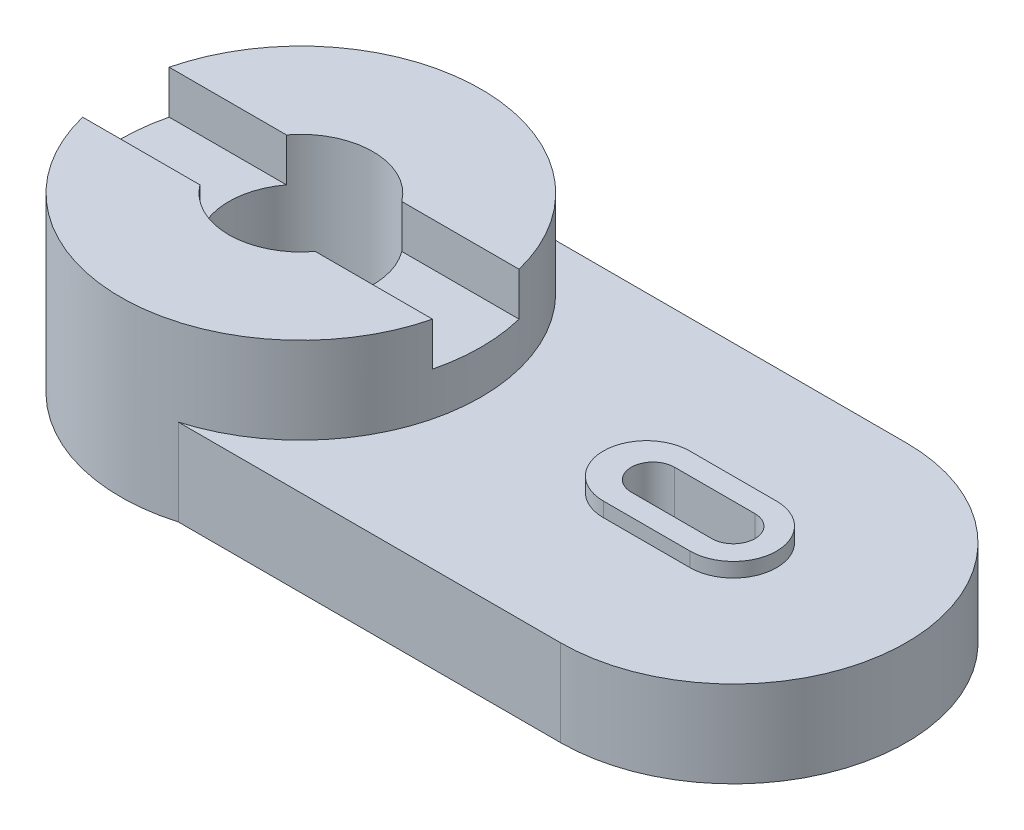
ISO-10303-21;
HEADER;
FILE_DESCRIPTION(('STEP AP214'),'2;1');
FILE_NAME('part.step','',(''),(''),'','','');
FILE_SCHEMA(('AUTOMOTIVE_DESIGN { 1 0 10303 214 1 1 1 1 }'));
ENDSEC;
DATA;
#1=APPLICATION_CONTEXT('core data for automotive mechanical design processes');
#2=APPLICATION_PROTOCOL_DEFINITION('international standard','automotive_design',2000,#1);
#3=PRODUCT_CONTEXT('',#1,'mechanical');
#4=PRODUCT('Part','Part','',(#3));
#5=PRODUCT_RELATED_PRODUCT_CATEGORY('part','',(#4));
#6=PRODUCT_DEFINITION_FORMATION('','',#4);
#7=PRODUCT_DEFINITION_CONTEXT('part definition',#1,'design');
#8=PRODUCT_DEFINITION('design','',#6,#7);
#9=PRODUCT_DEFINITION_SHAPE('','',#8);
#10=(LENGTH_UNIT() NAMED_UNIT(*) SI_UNIT(.MILLI.,.METRE.));
#11=(NAMED_UNIT(*) PLANE_ANGLE_UNIT() SI_UNIT($,.RADIAN.));
#12=(NAMED_UNIT(*) SI_UNIT($,.STERADIAN.) SOLID_ANGLE_UNIT());
#13=UNCERTAINTY_MEASURE_WITH_UNIT(LENGTH_MEASURE(1.E-05),#10,'distance_accuracy_value','');
#14=(GEOMETRIC_REPRESENTATION_CONTEXT(3) GLOBAL_UNCERTAINTY_ASSIGNED_CONTEXT((#13)) GLOBAL_UNIT_ASSIGNED_CONTEXT((#10,
#11,#12)) REPRESENTATION_CONTEXT('',''));
#15=CARTESIAN_POINT('',(0.,0.,0.));
#16=DIRECTION('',(0.,0.,1.));
#17=DIRECTION('',(1.,0.,0.));
#18=AXIS2_PLACEMENT_3D('',#15,#16,#17);
#19=CARTESIAN_POINT('',(-76.2,60.96,0.));
#20=DIRECTION('',(0.,1.,0.));
#21=DIRECTION('',(0.,0.,1.));
#22=AXIS2_PLACEMENT_3D('',#19,#20,#21);
#23=PLANE('',#22);
#24=DIRECTION('',(1.,0.,0.));
#25=VECTOR('',#24,1.);
#26=CARTESIAN_POINT('',(-137.844078385519,60.96,15.24));
#27=LINE('',#26,#25);
#28=CARTESIAN_POINT('',(-137.844078385519,60.96,15.24));
#29=VERTEX_POINT('',#28);
#30=CARTESIAN_POINT('',(-96.52,60.96,15.24));
#31=VERTEX_POINT('',#30);
#32=EDGE_CURVE('E186',#29,#31,#27,.T.);
#33=ORIENTED_EDGE('',*,*,#32,.F.);
#34=CARTESIAN_POINT('',(-76.2,60.96,0.));
#35=DIRECTION('',(0.,1.,0.));
#36=DIRECTION('',(0.,0.,1.));
#37=AXIS2_PLACEMENT_3D('',#34,#35,#36);
#38=CIRCLE('',#37,63.5);
#39=CARTESIAN_POINT('',(-14.555921614481,60.96,15.24));
#40=VERTEX_POINT('',#39);
#41=EDGE_CURVE('E281',#29,#40,#38,.T.);
#42=ORIENTED_EDGE('',*,*,#41,.T.);
#43=CARTESIAN_POINT('',(-55.88,60.96,15.24));
#44=VERTEX_POINT('',#43);
#45=EDGE_CURVE('E329',#44,#40,#27,.T.);
#46=ORIENTED_EDGE('',*,*,#45,.F.);
#47=CARTESIAN_POINT('',(-76.2,60.96,0.));
#48=DIRECTION('',(0.,1.,0.));
#49=DIRECTION('',(0.,0.,1.));
#50=AXIS2_PLACEMENT_3D('',#47,#48,#49);
#51=CIRCLE('',#50,25.4);
#52=EDGE_CURVE('E271',#31,#44,#51,.T.);
#53=ORIENTED_EDGE('',*,*,#52,.F.);
#54=EDGE_LOOP('',(#33,#42,#46,#53));
#55=FACE_BOUND('',#54,.T.);
#56=ADVANCED_FACE('F33',(#55),#23,.T.);
#57=CARTESIAN_POINT('',(0.,30.48,0.));
#58=DIRECTION('',(0.,-1.,0.));
#59=DIRECTION('',(0.,0.,-1.));
#60=AXIS2_PLACEMENT_3D('',#57,#58,#59);
#61=PLANE('',#60);
#62=CARTESIAN_POINT('',(-76.2,30.48,0.));
#63=DIRECTION('',(0.,-1.,0.));
#64=DIRECTION('',(0.,0.,-1.));
#65=AXIS2_PLACEMENT_3D('',#62,#63,#64);
#66=CIRCLE('',#65,63.5);
#67=CARTESIAN_POINT('',(-58.42,30.48,60.96));
#68=VERTEX_POINT('',#67);
#69=CARTESIAN_POINT('',(-58.4199999999999,30.48,-60.96));
#70=VERTEX_POINT('',#69);
#71=EDGE_CURVE('E286',#68,#70,#66,.F.);
#72=ORIENTED_EDGE('',*,*,#71,.F.);
#73=DIRECTION('',(1.,0.,0.));
#74=VECTOR('',#73,1.);
#75=CARTESIAN_POINT('',(-76.2,30.48,60.96));
#76=LINE('',#75,#74);
#77=CARTESIAN_POINT('',(76.2,30.48,60.96));
#78=VERTEX_POINT('',#77);
#79=EDGE_CURVE('E298',#68,#78,#76,.T.);
#80=ORIENTED_EDGE('',*,*,#79,.T.);
#81=CARTESIAN_POINT('',(76.2,30.48,0.));
#82=DIRECTION('',(0.,1.,0.));
#83=DIRECTION('',(0.,0.,-1.));
#84=AXIS2_PLACEMENT_3D('',#81,#82,#83);
#85=CIRCLE('',#84,60.96);
#86=CARTESIAN_POINT('',(76.2,30.48,-60.96));
#87=VERTEX_POINT('',#86);
#88=EDGE_CURVE('E267',#78,#87,#85,.T.);
#89=ORIENTED_EDGE('',*,*,#88,.T.);
#90=DIRECTION('',(-1.,0.,0.));
#91=VECTOR('',#90,1.);
#92=CARTESIAN_POINT('',(-76.2,30.48,-60.96));
#93=LINE('',#92,#91);
#94=EDGE_CURVE('E296',#87,#70,#93,.T.);
#95=ORIENTED_EDGE('',*,*,#94,.T.);
#96=EDGE_LOOP('',(#72,#80,#89,#95));
#97=FACE_BOUND('',#96,.T.);
#98=CARTESIAN_POINT('',(76.2,30.48,0.));
#99=DIRECTION('',(0.,1.,0.));
#100=DIRECTION('',(0.,0.,1.));
#101=AXIS2_PLACEMENT_3D('',#98,#99,#100);
#102=CIRCLE('',#101,15.24);
#103=CARTESIAN_POINT('',(76.2,30.48,15.24));
#104=VERTEX_POINT('',#103);
#105=CARTESIAN_POINT('',(76.2,30.48,-15.24));
#106=VERTEX_POINT('',#105);
#107=EDGE_CURVE('E228',#104,#106,#102,.T.);
#108=ORIENTED_EDGE('',*,*,#107,.F.);
#109=DIRECTION('',(1.,0.,0.));
#110=VECTOR('',#109,1.);
#111=CARTESIAN_POINT('',(76.2,30.48,15.24));
#112=LINE('',#111,#110);
#113=CARTESIAN_POINT('',(45.5973373324809,30.48,15.24));
#114=VERTEX_POINT('',#113);
#115=EDGE_CURVE('E239',#114,#104,#112,.T.);
#116=ORIENTED_EDGE('',*,*,#115,.F.);
#117=CARTESIAN_POINT('',(45.5973373324809,30.48,0.));
#118=DIRECTION('',(0.,1.,0.));
#119=DIRECTION('',(0.,0.,1.));
#120=AXIS2_PLACEMENT_3D('',#117,#118,#119);
#121=CIRCLE('',#120,15.24);
#122=CARTESIAN_POINT('',(45.5973373324809,30.48,-15.24));
#123=VERTEX_POINT('',#122);
#124=EDGE_CURVE('E251',#123,#114,#121,.T.);
#125=ORIENTED_EDGE('',*,*,#124,.F.);
#126=DIRECTION('',(-1.,0.,0.));
#127=VECTOR('',#126,1.);
#128=CARTESIAN_POINT('',(76.2,30.48,-15.24));
#129=LINE('',#128,#127);
#130=EDGE_CURVE('E248',#106,#123,#129,.T.);
#131=ORIENTED_EDGE('',*,*,#130,.F.);
#132=EDGE_LOOP('',(#108,#116,#125,#131));
#133=FACE_BOUND('',#132,.T.);
#134=ADVANCED_FACE('F358',(#97,#133),#61,.F.);
#135=CARTESIAN_POINT('',(-76.2,30.48,-60.96));
#136=DIRECTION('',(0.,0.,1.));
#137=DIRECTION('',(1.,0.,0.));
#138=AXIS2_PLACEMENT_3D('',#135,#136,#137);
#139=PLANE('',#138);
#140=DIRECTION('',(0.,-1.,0.));
#141=VECTOR('',#140,1.);
#142=CARTESIAN_POINT('',(-58.4199999999999,60.96,-60.96));
#143=LINE('',#142,#141);
#144=CARTESIAN_POINT('',(-58.4199999999999,0.,-60.96));
#145=VERTEX_POINT('',#144);
#146=EDGE_CURVE('E292',#70,#145,#143,.T.);
#147=ORIENTED_EDGE('',*,*,#146,.F.);
#148=ORIENTED_EDGE('',*,*,#94,.F.);
#149=DIRECTION('',(0.,-1.,0.));
#150=VECTOR('',#149,1.);
#151=CARTESIAN_POINT('',(76.2,30.48,-60.96));
#152=LINE('',#151,#150);
#153=CARTESIAN_POINT('',(76.2,0.,-60.96));
#154=VERTEX_POINT('',#153);
#155=EDGE_CURVE('E306',#87,#154,#152,.T.);
#156=ORIENTED_EDGE('',*,*,#155,.T.);
#157=DIRECTION('',(-1.,0.,0.));
#158=VECTOR('',#157,1.);
#159=CARTESIAN_POINT('',(-76.2,0.,-60.96));
#160=LINE('',#159,#158);
#161=EDGE_CURVE('E295',#154,#145,#160,.T.);
#162=ORIENTED_EDGE('',*,*,#161,.T.);
#163=EDGE_LOOP('',(#147,#148,#156,#162));
#164=FACE_BOUND('',#163,.T.);
#165=ADVANCED_FACE('F35',(#164),#139,.F.);
#166=CARTESIAN_POINT('',(-76.2,30.48,60.96));
#167=DIRECTION('',(0.,0.,-1.));
#168=DIRECTION('',(-1.,0.,0.));
#169=AXIS2_PLACEMENT_3D('',#166,#167,#168);
#170=PLANE('',#169);
#171=DIRECTION('',(0.,-1.,0.));
#172=VECTOR('',#171,1.);
#173=CARTESIAN_POINT('',(-58.42,60.96,60.96));
#174=LINE('',#173,#172);
#175=CARTESIAN_POINT('',(-58.42,0.,60.96));
#176=VERTEX_POINT('',#175);
#177=EDGE_CURVE('E289',#176,#68,#174,.F.);
#178=ORIENTED_EDGE('',*,*,#177,.F.);
#179=DIRECTION('',(1.,0.,0.));
#180=VECTOR('',#179,1.);
#181=CARTESIAN_POINT('',(-76.2,0.,60.96));
#182=LINE('',#181,#180);
#183=CARTESIAN_POINT('',(76.2,0.,60.96));
#184=VERTEX_POINT('',#183);
#185=EDGE_CURVE('E299',#176,#184,#182,.T.);
#186=ORIENTED_EDGE('',*,*,#185,.T.);
#187=DIRECTION('',(0.,-1.,0.));
#188=VECTOR('',#187,1.);
#189=CARTESIAN_POINT('',(76.2,30.48,60.96));
#190=LINE('',#189,#188);
#191=EDGE_CURVE('E301',#78,#184,#190,.T.);
#192=ORIENTED_EDGE('',*,*,#191,.F.);
#193=ORIENTED_EDGE('',*,*,#79,.F.);
#194=EDGE_LOOP('',(#178,#186,#192,#193));
#195=FACE_BOUND('',#194,.T.);
#196=ADVANCED_FACE('F367',(#195),#170,.F.);
#197=CARTESIAN_POINT('',(0.,0.,0.));
#198=DIRECTION('',(0.,-1.,0.));
#199=DIRECTION('',(0.,0.,-1.));
#200=AXIS2_PLACEMENT_3D('',#197,#198,#199);
#201=PLANE('',#200);
#202=CARTESIAN_POINT('',(76.2,0.,0.));
#203=DIRECTION('',(0.,1.,0.));
#204=DIRECTION('',(0.,0.,1.));
#205=AXIS2_PLACEMENT_3D('',#202,#203,#204);
#206=CIRCLE('',#205,7.62);
#207=CARTESIAN_POINT('',(76.2,0.,7.62000000000001));
#208=VERTEX_POINT('',#207);
#209=CARTESIAN_POINT('',(76.2,0.,-7.61999999999999));
#210=VERTEX_POINT('',#209);
#211=EDGE_CURVE('E201',#208,#210,#206,.T.);
#212=ORIENTED_EDGE('',*,*,#211,.T.);
#213=DIRECTION('',(-1.,0.,0.));
#214=VECTOR('',#213,1.);
#215=CARTESIAN_POINT('',(76.2,0.,-7.61999999999999));
#216=LINE('',#215,#214);
#217=CARTESIAN_POINT('',(47.8460105471044,0.,-7.62));
#218=VERTEX_POINT('',#217);
#219=EDGE_CURVE('E204',#210,#218,#216,.T.);
#220=ORIENTED_EDGE('',*,*,#219,.T.);
#221=CARTESIAN_POINT('',(47.8460105471044,0.,0.));
#222=DIRECTION('',(0.,1.,0.));
#223=DIRECTION('',(0.,0.,1.));
#224=AXIS2_PLACEMENT_3D('',#221,#222,#223);
#225=CIRCLE('',#224,7.62);
#226=CARTESIAN_POINT('',(47.8460105471044,0.,7.62));
#227=VERTEX_POINT('',#226);
#228=EDGE_CURVE('E208',#218,#227,#225,.T.);
#229=ORIENTED_EDGE('',*,*,#228,.T.);
#230=DIRECTION('',(1.,0.,0.));
#231=VECTOR('',#230,1.);
#232=CARTESIAN_POINT('',(76.2,0.,7.62000000000001));
#233=LINE('',#232,#231);
#234=EDGE_CURVE('E211',#227,#208,#233,.T.);
#235=ORIENTED_EDGE('',*,*,#234,.T.);
#236=EDGE_LOOP('',(#212,#220,#229,#235));
#237=FACE_BOUND('',#236,.T.);
#238=CARTESIAN_POINT('',(-76.2,0.,0.));
#239=DIRECTION('',(0.,1.,0.));
#240=DIRECTION('',(0.,0.,1.));
#241=AXIS2_PLACEMENT_3D('',#238,#239,#240);
#242=CIRCLE('',#241,25.4);
#243=CARTESIAN_POINT('',(-76.2,0.,25.4));
#244=VERTEX_POINT('',#243);
#245=EDGE_CURVE('E274',#244,#244,#242,.T.);
#246=ORIENTED_EDGE('',*,*,#245,.T.);
#247=EDGE_LOOP('',(#246));
#248=FACE_BOUND('',#247,.T.);
#249=ORIENTED_EDGE('',*,*,#185,.F.);
#250=CARTESIAN_POINT('',(-76.2,0.,0.));
#251=DIRECTION('',(0.,1.,0.));
#252=DIRECTION('',(0.,0.,1.));
#253=AXIS2_PLACEMENT_3D('',#250,#251,#252);
#254=CIRCLE('',#253,63.5);
#255=EDGE_CURVE('E277',#145,#176,#254,.T.);
#256=ORIENTED_EDGE('',*,*,#255,.F.);
#257=ORIENTED_EDGE('',*,*,#161,.F.);
#258=CARTESIAN_POINT('',(76.2,0.,0.));
#259=DIRECTION('',(0.,1.,0.));
#260=DIRECTION('',(0.,0.,-1.));
#261=AXIS2_PLACEMENT_3D('',#258,#259,#260);
#262=CIRCLE('',#261,60.96);
#263=EDGE_CURVE('E268',#184,#154,#262,.T.);
#264=ORIENTED_EDGE('',*,*,#263,.F.);
#265=EDGE_LOOP('',(#249,#256,#257,#264));
#266=FACE_BOUND('',#265,.T.);
#267=ADVANCED_FACE('F355',(#237,#248,#266),#201,.T.);
#268=CARTESIAN_POINT('',(-76.2,60.96,0.));
#269=DIRECTION('',(0.,-1.,0.));
#270=DIRECTION('',(0.,0.,-1.));
#271=AXIS2_PLACEMENT_3D('',#268,#269,#270);
#272=CYLINDRICAL_SURFACE('',#271,63.5);
#273=CARTESIAN_POINT('',(-76.2,45.72,0.));
#274=DIRECTION('',(0.,1.,0.));
#275=DIRECTION('',(0.,0.,1.));
#276=AXIS2_PLACEMENT_3D('',#273,#274,#275);
#277=CIRCLE('',#276,63.5);
#278=CARTESIAN_POINT('',(-14.555921614481,45.72,15.24));
#279=VERTEX_POINT('',#278);
#280=CARTESIAN_POINT('',(-14.555921614481,45.72,-15.24));
#281=VERTEX_POINT('',#280);
#282=EDGE_CURVE('E179',#279,#281,#277,.T.);
#283=ORIENTED_EDGE('',*,*,#282,.F.);
#284=DIRECTION('',(0.,1.,0.));
#285=VECTOR('',#284,1.);
#286=CARTESIAN_POINT('',(-14.555921614481,45.72,15.24));
#287=LINE('',#286,#285);
#288=EDGE_CURVE('E218',#279,#40,#287,.T.);
#289=ORIENTED_EDGE('',*,*,#288,.T.);
#290=ORIENTED_EDGE('',*,*,#41,.F.);
#291=DIRECTION('',(0.,1.,0.));
#292=VECTOR('',#291,1.);
#293=CARTESIAN_POINT('',(-137.844078385519,45.72,15.24));
#294=LINE('',#293,#292);
#295=CARTESIAN_POINT('',(-137.844078385519,45.72,15.24));
#296=VERTEX_POINT('',#295);
#297=EDGE_CURVE('E196',#296,#29,#294,.T.);
#298=ORIENTED_EDGE('',*,*,#297,.F.);
#299=CARTESIAN_POINT('',(-76.2,45.72,0.));
#300=DIRECTION('',(0.,1.,0.));
#301=DIRECTION('',(0.,0.,-1.));
#302=AXIS2_PLACEMENT_3D('',#299,#300,#301);
#303=CIRCLE('',#302,63.5);
#304=CARTESIAN_POINT('',(-137.844078385519,45.72,-15.24));
#305=VERTEX_POINT('',#304);
#306=EDGE_CURVE('E175',#305,#296,#303,.T.);
#307=ORIENTED_EDGE('',*,*,#306,.F.);
#308=DIRECTION('',(0.,1.,0.));
#309=VECTOR('',#308,1.);
#310=CARTESIAN_POINT('',(-137.844078385519,45.72,-15.24));
#311=LINE('',#310,#309);
#312=CARTESIAN_POINT('',(-137.844078385519,60.96,-15.24));
#313=VERTEX_POINT('',#312);
#314=EDGE_CURVE('E194',#305,#313,#311,.T.);
#315=ORIENTED_EDGE('',*,*,#314,.T.);
#316=CARTESIAN_POINT('',(-14.555921614481,60.96,-15.24));
#317=VERTEX_POINT('',#316);
#318=EDGE_CURVE('E193',#317,#313,#38,.T.);
#319=ORIENTED_EDGE('',*,*,#318,.F.);
#320=DIRECTION('',(0.,1.,0.));
#321=VECTOR('',#320,1.);
#322=CARTESIAN_POINT('',(-14.555921614481,45.72,-15.24));
#323=LINE('',#322,#321);
#324=EDGE_CURVE('E170',#281,#317,#323,.T.);
#325=ORIENTED_EDGE('',*,*,#324,.F.);
#326=EDGE_LOOP('',(#283,#289,#290,#298,#307,#315,#319,#325));
#327=FACE_BOUND('',#326,.T.);
#328=ORIENTED_EDGE('',*,*,#71,.T.);
#329=ORIENTED_EDGE('',*,*,#146,.T.);
#330=ORIENTED_EDGE('',*,*,#255,.T.);
#331=ORIENTED_EDGE('',*,*,#177,.T.);
#332=EDGE_LOOP('',(#328,#329,#330,#331));
#333=FACE_BOUND('',#332,.T.);
#334=ADVANCED_FACE('F189',(#327,#333),#272,.T.);
#335=DIRECTION('',(-1.,0.,0.));
#336=VECTOR('',#335,1.);
#337=CARTESIAN_POINT('',(-137.844078385519,60.96,-15.24));
#338=LINE('',#337,#336);
#339=CARTESIAN_POINT('',(-55.88,60.96,-15.24));
#340=VERTEX_POINT('',#339);
#341=EDGE_CURVE('E327',#317,#340,#338,.T.);
#342=ORIENTED_EDGE('',*,*,#341,.F.);
#343=ORIENTED_EDGE('',*,*,#318,.T.);
#344=CARTESIAN_POINT('',(-96.52,60.96,-15.24));
#345=VERTEX_POINT('',#344);
#346=EDGE_CURVE('E330',#345,#313,#338,.T.);
#347=ORIENTED_EDGE('',*,*,#346,.F.);
#348=EDGE_CURVE('E278',#340,#345,#51,.T.);
#349=ORIENTED_EDGE('',*,*,#348,.F.);
#350=EDGE_LOOP('',(#342,#343,#347,#349));
#351=FACE_BOUND('',#350,.T.);
#352=ADVANCED_FACE('F346',(#351),#23,.T.);
#353=CARTESIAN_POINT('',(-76.2,0.,0.));
#354=DIRECTION('',(0.,1.,0.));
#355=DIRECTION('',(0.,0.,1.));
#356=AXIS2_PLACEMENT_3D('',#353,#354,#355);
#357=CYLINDRICAL_SURFACE('',#356,25.4);
#358=CARTESIAN_POINT('',(-76.2,45.72,0.));
#359=DIRECTION('',(0.,1.,0.));
#360=DIRECTION('',(0.,0.,1.));
#361=AXIS2_PLACEMENT_3D('',#358,#359,#360);
#362=CIRCLE('',#361,25.4);
#363=CARTESIAN_POINT('',(-96.52,45.72,15.24));
#364=VERTEX_POINT('',#363);
#365=CARTESIAN_POINT('',(-96.52,45.72,-15.24));
#366=VERTEX_POINT('',#365);
#367=EDGE_CURVE('E310',#364,#366,#362,.F.);
#368=ORIENTED_EDGE('',*,*,#367,.F.);
#369=DIRECTION('',(0.,1.,0.));
#370=VECTOR('',#369,1.);
#371=CARTESIAN_POINT('',(-96.52,0.,15.24));
#372=LINE('',#371,#370);
#373=EDGE_CURVE('E11',#364,#31,#372,.T.);
#374=ORIENTED_EDGE('',*,*,#373,.T.);
#375=ORIENTED_EDGE('',*,*,#52,.T.);
#376=DIRECTION('',(0.,1.,0.));
#377=VECTOR('',#376,1.);
#378=CARTESIAN_POINT('',(-55.88,0.,15.24));
#379=LINE('',#378,#377);
#380=CARTESIAN_POINT('',(-55.88,45.72,15.24));
#381=VERTEX_POINT('',#380);
#382=EDGE_CURVE('E312',#44,#381,#379,.F.);
#383=ORIENTED_EDGE('',*,*,#382,.T.);
#384=CARTESIAN_POINT('',(-55.88,45.72,-15.24));
#385=VERTEX_POINT('',#384);
#386=EDGE_CURVE('E308',#385,#381,#362,.F.);
#387=ORIENTED_EDGE('',*,*,#386,.F.);
#388=DIRECTION('',(0.,1.,0.));
#389=VECTOR('',#388,1.);
#390=CARTESIAN_POINT('',(-55.88,0.,-15.24));
#391=LINE('',#390,#389);
#392=EDGE_CURVE('E173',#385,#340,#391,.T.);
#393=ORIENTED_EDGE('',*,*,#392,.T.);
#394=ORIENTED_EDGE('',*,*,#348,.T.);
#395=DIRECTION('',(0.,1.,0.));
#396=VECTOR('',#395,1.);
#397=CARTESIAN_POINT('',(-96.52,0.,-15.24));
#398=LINE('',#397,#396);
#399=EDGE_CURVE('E41',#345,#366,#398,.F.);
#400=ORIENTED_EDGE('',*,*,#399,.T.);
#401=EDGE_LOOP('',(#368,#374,#375,#383,#387,#393,#394,#400));
#402=FACE_BOUND('',#401,.T.);
#403=ORIENTED_EDGE('',*,*,#245,.F.);
#404=EDGE_LOOP('',(#403));
#405=FACE_BOUND('',#404,.T.);
#406=ADVANCED_FACE('F342',(#402,#405),#357,.F.);
#407=CARTESIAN_POINT('',(76.2,0.,0.));
#408=DIRECTION('',(0.,1.,0.));
#409=DIRECTION('',(0.,0.,1.));
#410=AXIS2_PLACEMENT_3D('',#407,#408,#409);
#411=CYLINDRICAL_SURFACE('',#410,60.96);
#412=ORIENTED_EDGE('',*,*,#88,.F.);
#413=ORIENTED_EDGE('',*,*,#191,.T.);
#414=ORIENTED_EDGE('',*,*,#263,.T.);
#415=ORIENTED_EDGE('',*,*,#155,.F.);
#416=EDGE_LOOP('',(#412,#413,#414,#415));
#417=FACE_BOUND('',#416,.T.);
#418=ADVANCED_FACE('F353',(#417),#411,.T.);
#419=CARTESIAN_POINT('',(76.2,35.56,0.));
#420=DIRECTION('',(0.,-1.,0.));
#421=DIRECTION('',(0.,0.,-1.));
#422=AXIS2_PLACEMENT_3D('',#419,#420,#421);
#423=CYLINDRICAL_SURFACE('',#422,15.24);
#424=ORIENTED_EDGE('',*,*,#107,.T.);
#425=DIRECTION('',(0.,-1.,0.));
#426=VECTOR('',#425,1.);
#427=CARTESIAN_POINT('',(76.2,35.56,-15.24));
#428=LINE('',#427,#426);
#429=CARTESIAN_POINT('',(76.2,35.56,-15.24));
#430=VERTEX_POINT('',#429);
#431=EDGE_CURVE('E264',#430,#106,#428,.T.);
#432=ORIENTED_EDGE('',*,*,#431,.F.);
#433=CARTESIAN_POINT('',(76.2,35.56,0.));
#434=DIRECTION('',(0.,1.,0.));
#435=DIRECTION('',(0.,0.,1.));
#436=AXIS2_PLACEMENT_3D('',#433,#434,#435);
#437=CIRCLE('',#436,15.24);
#438=CARTESIAN_POINT('',(76.2,35.56,15.24));
#439=VERTEX_POINT('',#438);
#440=EDGE_CURVE('E235',#439,#430,#437,.T.);
#441=ORIENTED_EDGE('',*,*,#440,.F.);
#442=DIRECTION('',(0.,-1.,0.));
#443=VECTOR('',#442,1.);
#444=CARTESIAN_POINT('',(76.2,35.56,15.24));
#445=LINE('',#444,#443);
#446=EDGE_CURVE('E245',#439,#104,#445,.T.);
#447=ORIENTED_EDGE('',*,*,#446,.T.);
#448=EDGE_LOOP('',(#424,#432,#441,#447));
#449=FACE_BOUND('',#448,.T.);
#450=ADVANCED_FACE('F389',(#449),#423,.T.);
#451=CARTESIAN_POINT('',(76.2,35.56,-15.24));
#452=DIRECTION('',(0.,0.,1.));
#453=DIRECTION('',(1.,0.,0.));
#454=AXIS2_PLACEMENT_3D('',#451,#452,#453);
#455=PLANE('',#454);
#456=ORIENTED_EDGE('',*,*,#130,.T.);
#457=DIRECTION('',(0.,-1.,0.));
#458=VECTOR('',#457,1.);
#459=CARTESIAN_POINT('',(45.5973373324809,35.56,-15.24));
#460=LINE('',#459,#458);
#461=CARTESIAN_POINT('',(45.5973373324809,35.56,-15.24));
#462=VERTEX_POINT('',#461);
#463=EDGE_CURVE('E261',#462,#123,#460,.T.);
#464=ORIENTED_EDGE('',*,*,#463,.F.);
#465=DIRECTION('',(-1.,0.,0.));
#466=VECTOR('',#465,1.);
#467=CARTESIAN_POINT('',(76.2,35.56,-15.24));
#468=LINE('',#467,#466);
#469=EDGE_CURVE('E238',#430,#462,#468,.T.);
#470=ORIENTED_EDGE('',*,*,#469,.F.);
#471=ORIENTED_EDGE('',*,*,#431,.T.);
#472=EDGE_LOOP('',(#456,#464,#470,#471));
#473=FACE_BOUND('',#472,.T.);
#474=ADVANCED_FACE('F394',(#473),#455,.F.);
#475=CARTESIAN_POINT('',(45.5973373324809,35.56,0.));
#476=DIRECTION('',(0.,-1.,0.));
#477=DIRECTION('',(0.,0.,-1.));
#478=AXIS2_PLACEMENT_3D('',#475,#476,#477);
#479=CYLINDRICAL_SURFACE('',#478,15.24);
#480=ORIENTED_EDGE('',*,*,#124,.T.);
#481=DIRECTION('',(0.,-1.,0.));
#482=VECTOR('',#481,1.);
#483=CARTESIAN_POINT('',(45.5973373324809,35.56,15.24));
#484=LINE('',#483,#482);
#485=CARTESIAN_POINT('',(45.5973373324809,35.56,15.24));
#486=VERTEX_POINT('',#485);
#487=EDGE_CURVE('E258',#486,#114,#484,.T.);
#488=ORIENTED_EDGE('',*,*,#487,.F.);
#489=CARTESIAN_POINT('',(45.5973373324809,35.56,0.));
#490=DIRECTION('',(0.,1.,0.));
#491=DIRECTION('',(0.,0.,1.));
#492=AXIS2_PLACEMENT_3D('',#489,#490,#491);
#493=CIRCLE('',#492,15.24);
#494=EDGE_CURVE('E241',#462,#486,#493,.T.);
#495=ORIENTED_EDGE('',*,*,#494,.F.);
#496=ORIENTED_EDGE('',*,*,#463,.T.);
#497=EDGE_LOOP('',(#480,#488,#495,#496));
#498=FACE_BOUND('',#497,.T.);
#499=ADVANCED_FACE('F400',(#498),#479,.T.);
#500=CARTESIAN_POINT('',(76.2,35.56,15.24));
#501=DIRECTION('',(0.,0.,-1.));
#502=DIRECTION('',(-1.,0.,0.));
#503=AXIS2_PLACEMENT_3D('',#500,#501,#502);
#504=PLANE('',#503);
#505=ORIENTED_EDGE('',*,*,#115,.T.);
#506=ORIENTED_EDGE('',*,*,#446,.F.);
#507=DIRECTION('',(1.,0.,0.));
#508=VECTOR('',#507,1.);
#509=CARTESIAN_POINT('',(76.2,35.56,15.24));
#510=LINE('',#509,#508);
#511=EDGE_CURVE('E243',#486,#439,#510,.T.);
#512=ORIENTED_EDGE('',*,*,#511,.F.);
#513=ORIENTED_EDGE('',*,*,#487,.T.);
#514=EDGE_LOOP('',(#505,#506,#512,#513));
#515=FACE_BOUND('',#514,.T.);
#516=ADVANCED_FACE('F404',(#515),#504,.F.);
#517=CARTESIAN_POINT('',(76.2,35.56,0.));
#518=DIRECTION('',(0.,1.,0.));
#519=DIRECTION('',(0.,0.,1.));
#520=AXIS2_PLACEMENT_3D('',#517,#518,#519);
#521=PLANE('',#520);
#522=CARTESIAN_POINT('',(76.2,35.56,0.));
#523=DIRECTION('',(0.,1.,0.));
#524=DIRECTION('',(0.,0.,1.));
#525=AXIS2_PLACEMENT_3D('',#522,#523,#524);
#526=CIRCLE('',#525,7.62);
#527=CARTESIAN_POINT('',(76.2,35.56,7.62000000000001));
#528=VERTEX_POINT('',#527);
#529=CARTESIAN_POINT('',(76.2,35.56,-7.61999999999999));
#530=VERTEX_POINT('',#529);
#531=EDGE_CURVE('E215',#528,#530,#526,.T.);
#532=ORIENTED_EDGE('',*,*,#531,.F.);
#533=DIRECTION('',(1.,0.,0.));
#534=VECTOR('',#533,1.);
#535=CARTESIAN_POINT('',(76.2,35.56,7.62000000000001));
#536=LINE('',#535,#534);
#537=CARTESIAN_POINT('',(47.8460105471044,35.56,7.62));
#538=VERTEX_POINT('',#537);
#539=EDGE_CURVE('E205',#538,#528,#536,.T.);
#540=ORIENTED_EDGE('',*,*,#539,.F.);
#541=CARTESIAN_POINT('',(47.8460105471044,35.56,0.));
#542=DIRECTION('',(0.,1.,0.));
#543=DIRECTION('',(0.,0.,1.));
#544=AXIS2_PLACEMENT_3D('',#541,#542,#543);
#545=CIRCLE('',#544,7.62);
#546=CARTESIAN_POINT('',(47.8460105471044,35.56,-7.62));
#547=VERTEX_POINT('',#546);
#548=EDGE_CURVE('E221',#547,#538,#545,.T.);
#549=ORIENTED_EDGE('',*,*,#548,.F.);
#550=DIRECTION('',(-1.,0.,0.));
#551=VECTOR('',#550,1.);
#552=CARTESIAN_POINT('',(76.2,35.56,-7.61999999999999));
#553=LINE('',#552,#551);
#554=EDGE_CURVE('E217',#530,#547,#553,.T.);
#555=ORIENTED_EDGE('',*,*,#554,.F.);
#556=EDGE_LOOP('',(#532,#540,#549,#555));
#557=FACE_BOUND('',#556,.T.);
#558=ORIENTED_EDGE('',*,*,#440,.T.);
#559=ORIENTED_EDGE('',*,*,#469,.T.);
#560=ORIENTED_EDGE('',*,*,#494,.T.);
#561=ORIENTED_EDGE('',*,*,#511,.T.);
#562=EDGE_LOOP('',(#558,#559,#560,#561));
#563=FACE_BOUND('',#562,.T.);
#564=ADVANCED_FACE('F408',(#557,#563),#521,.T.);
#565=CARTESIAN_POINT('',(76.2,0.,0.));
#566=DIRECTION('',(0.,1.,0.));
#567=DIRECTION('',(0.,0.,1.));
#568=AXIS2_PLACEMENT_3D('',#565,#566,#567);
#569=CYLINDRICAL_SURFACE('',#568,7.62);
#570=ORIENTED_EDGE('',*,*,#531,.T.);
#571=DIRECTION('',(0.,1.,0.));
#572=VECTOR('',#571,1.);
#573=CARTESIAN_POINT('',(76.2,0.,-7.61999999999999));
#574=LINE('',#573,#572);
#575=EDGE_CURVE('E214',#210,#530,#574,.T.);
#576=ORIENTED_EDGE('',*,*,#575,.F.);
#577=ORIENTED_EDGE('',*,*,#211,.F.);
#578=DIRECTION('',(0.,1.,0.));
#579=VECTOR('',#578,1.);
#580=CARTESIAN_POINT('',(76.2,0.,7.62000000000001));
#581=LINE('',#580,#579);
#582=EDGE_CURVE('E226',#208,#528,#581,.T.);
#583=ORIENTED_EDGE('',*,*,#582,.T.);
#584=EDGE_LOOP('',(#570,#576,#577,#583));
#585=FACE_BOUND('',#584,.T.);
#586=ADVANCED_FACE('F412',(#585),#569,.F.);
#587=CARTESIAN_POINT('',(76.2,0.,7.62000000000001));
#588=DIRECTION('',(0.,0.,1.));
#589=DIRECTION('',(1.,0.,0.));
#590=AXIS2_PLACEMENT_3D('',#587,#588,#589);
#591=PLANE('',#590);
#592=ORIENTED_EDGE('',*,*,#539,.T.);
#593=ORIENTED_EDGE('',*,*,#582,.F.);
#594=ORIENTED_EDGE('',*,*,#234,.F.);
#595=DIRECTION('',(0.,1.,0.));
#596=VECTOR('',#595,1.);
#597=CARTESIAN_POINT('',(47.8460105471044,0.,7.62));
#598=LINE('',#597,#596);
#599=EDGE_CURVE('E229',#227,#538,#598,.T.);
#600=ORIENTED_EDGE('',*,*,#599,.T.);
#601=EDGE_LOOP('',(#592,#593,#594,#600));
#602=FACE_BOUND('',#601,.T.);
#603=ADVANCED_FACE('F416',(#602),#591,.F.);
#604=CARTESIAN_POINT('',(47.8460105471044,0.,0.));
#605=DIRECTION('',(0.,1.,0.));
#606=DIRECTION('',(0.,0.,1.));
#607=AXIS2_PLACEMENT_3D('',#604,#605,#606);
#608=CYLINDRICAL_SURFACE('',#607,7.62);
#609=ORIENTED_EDGE('',*,*,#548,.T.);
#610=ORIENTED_EDGE('',*,*,#599,.F.);
#611=ORIENTED_EDGE('',*,*,#228,.F.);
#612=DIRECTION('',(0.,1.,0.));
#613=VECTOR('',#612,1.);
#614=CARTESIAN_POINT('',(47.8460105471044,0.,-7.62));
#615=LINE('',#614,#613);
#616=EDGE_CURVE('E231',#218,#547,#615,.T.);
#617=ORIENTED_EDGE('',*,*,#616,.T.);
#618=EDGE_LOOP('',(#609,#610,#611,#617));
#619=FACE_BOUND('',#618,.T.);
#620=ADVANCED_FACE('F421',(#619),#608,.F.);
#621=CARTESIAN_POINT('',(76.2,0.,-7.61999999999999));
#622=DIRECTION('',(0.,0.,-1.));
#623=DIRECTION('',(-1.,0.,0.));
#624=AXIS2_PLACEMENT_3D('',#621,#622,#623);
#625=PLANE('',#624);
#626=ORIENTED_EDGE('',*,*,#554,.T.);
#627=ORIENTED_EDGE('',*,*,#616,.F.);
#628=ORIENTED_EDGE('',*,*,#219,.F.);
#629=ORIENTED_EDGE('',*,*,#575,.T.);
#630=EDGE_LOOP('',(#626,#627,#628,#629));
#631=FACE_BOUND('',#630,.T.);
#632=ADVANCED_FACE('F418',(#631),#625,.F.);
#633=CARTESIAN_POINT('',(-76.2,45.72,0.));
#634=DIRECTION('',(0.,1.,0.));
#635=DIRECTION('',(0.,0.,1.));
#636=AXIS2_PLACEMENT_3D('',#633,#634,#635);
#637=PLANE('',#636);
#638=ORIENTED_EDGE('',*,*,#386,.T.);
#639=DIRECTION('',(1.,0.,0.));
#640=VECTOR('',#639,1.);
#641=CARTESIAN_POINT('',(-137.844078385519,45.72,15.24));
#642=LINE('',#641,#640);
#643=EDGE_CURVE('E182',#381,#279,#642,.T.);
#644=ORIENTED_EDGE('',*,*,#643,.T.);
#645=ORIENTED_EDGE('',*,*,#282,.T.);
#646=DIRECTION('',(-1.,0.,0.));
#647=VECTOR('',#646,1.);
#648=CARTESIAN_POINT('',(-137.844078385519,45.72,-15.24));
#649=LINE('',#648,#647);
#650=EDGE_CURVE('E56',#281,#385,#649,.T.);
#651=ORIENTED_EDGE('',*,*,#650,.T.);
#652=EDGE_LOOP('',(#638,#644,#645,#651));
#653=FACE_BOUND('',#652,.T.);
#654=ADVANCED_FACE('F180',(#653),#637,.T.);
#655=CARTESIAN_POINT('',(-137.844078385519,45.72,-15.24));
#656=DIRECTION('',(0.,0.,-1.));
#657=DIRECTION('',(-1.,0.,0.));
#658=AXIS2_PLACEMENT_3D('',#655,#656,#657);
#659=PLANE('',#658);
#660=ORIENTED_EDGE('',*,*,#650,.F.);
#661=ORIENTED_EDGE('',*,*,#324,.T.);
#662=ORIENTED_EDGE('',*,*,#341,.T.);
#663=ORIENTED_EDGE('',*,*,#392,.F.);
#664=EDGE_LOOP('',(#660,#661,#662,#663));
#665=FACE_BOUND('',#664,.T.);
#666=ADVANCED_FACE('F168',(#665),#659,.F.);
#667=CARTESIAN_POINT('',(-137.844078385519,45.72,15.24));
#668=DIRECTION('',(0.,0.,1.));
#669=DIRECTION('',(1.,0.,0.));
#670=AXIS2_PLACEMENT_3D('',#667,#668,#669);
#671=PLANE('',#670);
#672=ORIENTED_EDGE('',*,*,#45,.T.);
#673=ORIENTED_EDGE('',*,*,#288,.F.);
#674=ORIENTED_EDGE('',*,*,#643,.F.);
#675=ORIENTED_EDGE('',*,*,#382,.F.);
#676=EDGE_LOOP('',(#672,#673,#674,#675));
#677=FACE_BOUND('',#676,.T.);
#678=ADVANCED_FACE('F341',(#677),#671,.F.);
#679=EDGE_CURVE('E48',#296,#364,#642,.T.);
#680=ORIENTED_EDGE('',*,*,#679,.F.);
#681=ORIENTED_EDGE('',*,*,#297,.T.);
#682=ORIENTED_EDGE('',*,*,#32,.T.);
#683=ORIENTED_EDGE('',*,*,#373,.F.);
#684=EDGE_LOOP('',(#680,#681,#682,#683));
#685=FACE_BOUND('',#684,.T.);
#686=ADVANCED_FACE('F335',(#685),#671,.F.);
#687=ORIENTED_EDGE('',*,*,#346,.T.);
#688=ORIENTED_EDGE('',*,*,#314,.F.);
#689=EDGE_CURVE('E176',#366,#305,#649,.T.);
#690=ORIENTED_EDGE('',*,*,#689,.F.);
#691=ORIENTED_EDGE('',*,*,#399,.F.);
#692=EDGE_LOOP('',(#687,#688,#690,#691));
#693=FACE_BOUND('',#692,.T.);
#694=ADVANCED_FACE('F322',(#693),#659,.F.);
#695=ORIENTED_EDGE('',*,*,#367,.T.);
#696=ORIENTED_EDGE('',*,*,#689,.T.);
#697=ORIENTED_EDGE('',*,*,#306,.T.);
#698=ORIENTED_EDGE('',*,*,#679,.T.);
#699=EDGE_LOOP('',(#695,#696,#697,#698));
#700=FACE_BOUND('',#699,.T.);
#701=ADVANCED_FACE('F319',(#700),#637,.T.);
#702=CLOSED_SHELL('',(#56,#134,#165,#196,#267,#334,#352,#406,#418,#450,#474,#499,#516,#564,#586,
#603,#620,#632,#654,#666,#678,#686,#694,#701));
#703=MANIFOLD_SOLID_BREP('B2',#702);
#704=ADVANCED_BREP_SHAPE_REPRESENTATION('',(#18,#703),#14);
#705=SHAPE_DEFINITION_REPRESENTATION(#9,#704);
ENDSEC;
END-ISO-10303-21;
